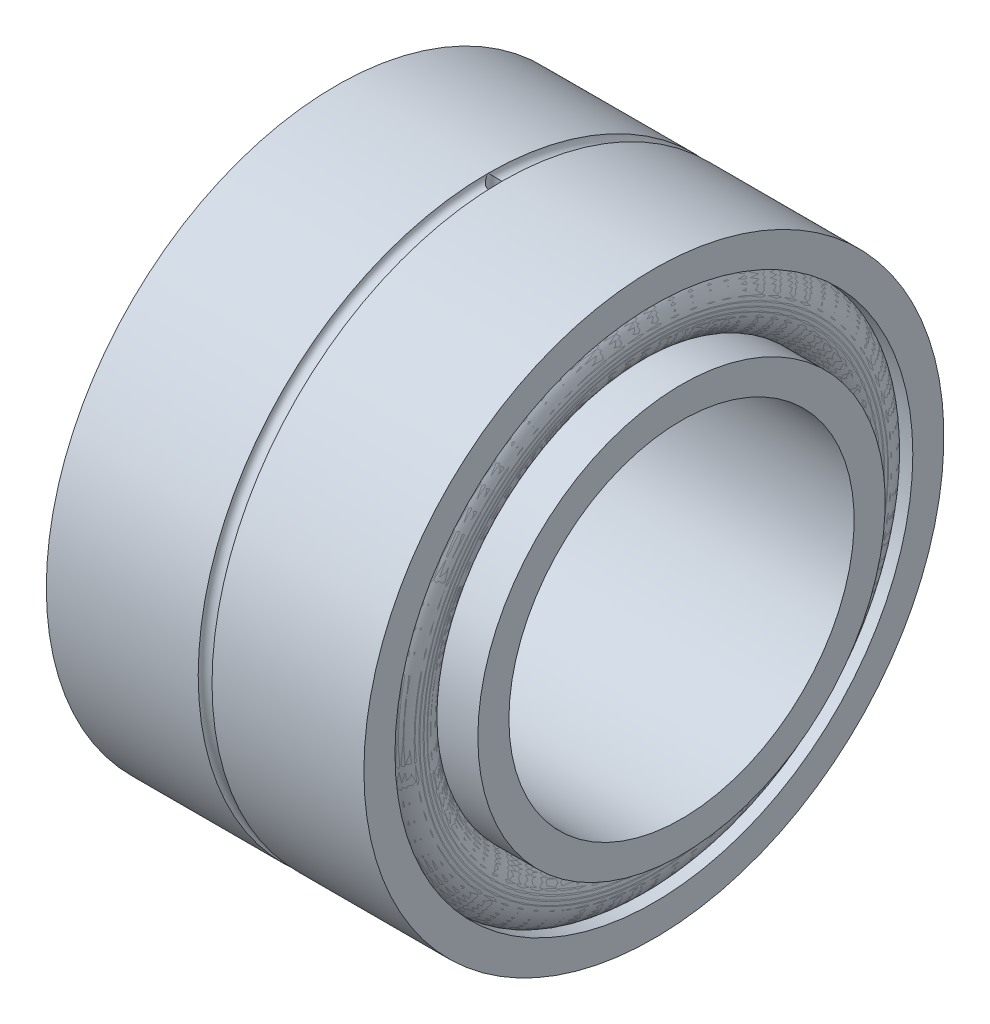
ISO-10303-21;
HEADER;
FILE_DESCRIPTION(('STEP AP214'),'2;1');
FILE_NAME('part.step','',(''),(''),'','','');
FILE_SCHEMA(('AUTOMOTIVE_DESIGN { 1 0 10303 214 1 1 1 1 }'));
ENDSEC;
DATA;
#1=APPLICATION_CONTEXT('core data for automotive mechanical design processes');
#2=APPLICATION_PROTOCOL_DEFINITION('international standard','automotive_design',2000,#1);
#3=PRODUCT_CONTEXT('',#1,'mechanical');
#4=PRODUCT('Part','Part','',(#3));
#5=PRODUCT_RELATED_PRODUCT_CATEGORY('part','',(#4));
#6=PRODUCT_DEFINITION_FORMATION('','',#4);
#7=PRODUCT_DEFINITION_CONTEXT('part definition',#1,'design');
#8=PRODUCT_DEFINITION('design','',#6,#7);
#9=PRODUCT_DEFINITION_SHAPE('','',#8);
#10=(LENGTH_UNIT() NAMED_UNIT(*) SI_UNIT(.MILLI.,.METRE.));
#11=(NAMED_UNIT(*) PLANE_ANGLE_UNIT() SI_UNIT($,.RADIAN.));
#12=(NAMED_UNIT(*) SI_UNIT($,.STERADIAN.) SOLID_ANGLE_UNIT());
#13=UNCERTAINTY_MEASURE_WITH_UNIT(LENGTH_MEASURE(1.E-05),#10,'distance_accuracy_value','');
#14=(GEOMETRIC_REPRESENTATION_CONTEXT(3) GLOBAL_UNCERTAINTY_ASSIGNED_CONTEXT((#13)) GLOBAL_UNIT_ASSIGNED_CONTEXT((#10,
#11,#12)) REPRESENTATION_CONTEXT('',''));
#15=CARTESIAN_POINT('',(0.,0.,0.));
#16=DIRECTION('',(0.,0.,1.));
#17=DIRECTION('',(1.,0.,0.));
#18=AXIS2_PLACEMENT_3D('',#15,#16,#17);
#19=CARTESIAN_POINT('',(0.,0.,0.));
#20=DIRECTION('',(-1.,0.,0.));
#21=DIRECTION('',(0.,0.,1.));
#22=AXIS2_PLACEMENT_3D('',#19,#20,#21);
#23=CYLINDRICAL_SURFACE('',#22,14.75);
#24=CARTESIAN_POINT('',(0.,0.,0.));
#25=DIRECTION('',(-1.,0.,0.));
#26=DIRECTION('',(0.,0.,1.));
#27=AXIS2_PLACEMENT_3D('',#24,#25,#26);
#28=CIRCLE('',#27,14.75);
#29=CARTESIAN_POINT('',(0.,0.,14.75));
#30=VERTEX_POINT('',#29);
#31=EDGE_CURVE('E11',#30,#30,#28,.T.);
#32=ORIENTED_EDGE('',*,*,#31,.F.);
#33=EDGE_LOOP('',(#32));
#34=FACE_BOUND('',#33,.T.);
#35=CARTESIAN_POINT('',(2.,0.,0.));
#36=DIRECTION('',(-1.,0.,0.));
#37=DIRECTION('',(0.,0.,1.));
#38=AXIS2_PLACEMENT_3D('',#35,#36,#37);
#39=CIRCLE('',#38,14.75);
#40=CARTESIAN_POINT('',(2.,0.,14.75));
#41=VERTEX_POINT('',#40);
#42=EDGE_CURVE('E114',#41,#41,#39,.T.);
#43=ORIENTED_EDGE('',*,*,#42,.T.);
#44=EDGE_LOOP('',(#43));
#45=FACE_BOUND('',#44,.T.);
#46=ADVANCED_FACE('F37',(#34,#45),#23,.T.);
#47=CARTESIAN_POINT('',(0.,14.75,0.));
#48=DIRECTION('',(1.,0.,0.));
#49=DIRECTION('',(0.,0.,-1.));
#50=AXIS2_PLACEMENT_3D('',#47,#48,#49);
#51=PLANE('',#50);
#52=CARTESIAN_POINT('',(0.,0.,0.));
#53=DIRECTION('',(-1.,0.,0.));
#54=DIRECTION('',(0.,0.,1.));
#55=AXIS2_PLACEMENT_3D('',#52,#53,#54);
#56=CIRCLE('',#55,12.5);
#57=CARTESIAN_POINT('',(0.,0.,12.5));
#58=VERTEX_POINT('',#57);
#59=EDGE_CURVE('E50',#58,#58,#56,.T.);
#60=ORIENTED_EDGE('',*,*,#59,.F.);
#61=EDGE_LOOP('',(#60));
#62=FACE_BOUND('',#61,.T.);
#63=ORIENTED_EDGE('',*,*,#31,.T.);
#64=EDGE_LOOP('',(#63));
#65=FACE_BOUND('',#64,.T.);
#66=ADVANCED_FACE('F105',(#62,#65),#51,.F.);
#67=CARTESIAN_POINT('',(0.,0.,0.));
#68=DIRECTION('',(-1.,0.,0.));
#69=DIRECTION('',(0.,0.,1.));
#70=AXIS2_PLACEMENT_3D('',#67,#68,#69);
#71=CYLINDRICAL_SURFACE('',#70,12.5);
#72=CARTESIAN_POINT('',(11.5,12.4899959967968,0.500000000000001));
#73=CARTESIAN_POINT('',(11.5280731633728,12.4899961315224,0.499998758798746));
#74=CARTESIAN_POINT('',(11.5561663964834,12.4900916618139,0.497627754285823));
#75=CARTESIAN_POINT('',(11.611578333317,12.4904635421187,0.488202712247756));
#76=CARTESIAN_POINT('',(11.6388960771565,12.4907401068309,0.481143114107626));
#77=CARTESIAN_POINT('',(11.6919462896622,12.4914426775378,0.462542918883272));
#78=CARTESIAN_POINT('',(11.7176795407324,12.4918686090698,0.451004554257524));
#79=CARTESIAN_POINT('',(11.7668367926558,12.4928218248314,0.423777660159961));
#80=CARTESIAN_POINT('',(11.7902613472097,12.4933490846693,0.408090129134241));
#81=CARTESIAN_POINT('',(11.8341597593796,12.4944459704595,0.372997754449342));
#82=CARTESIAN_POINT('',(11.8546318245942,12.4950156218316,0.353590669226713));
#83=CARTESIAN_POINT('',(11.8920289255691,12.4961328567103,0.311614354933469));
#84=CARTESIAN_POINT('',(11.9089538185401,12.4966804393279,0.289044998628435));
#85=CARTESIAN_POINT('',(11.93878028225,12.4976919893825,0.241376432340117));
#86=CARTESIAN_POINT('',(11.9516805764639,12.4981559302703,0.216276423015971));
#87=CARTESIAN_POINT('',(11.9730834220647,12.4989476710099,0.164264700944849));
#88=CARTESIAN_POINT('',(11.9815859979237,12.4992754716193,0.137352998280408));
#89=CARTESIAN_POINT('',(11.9939476435077,12.4997578274104,0.0824972113326851));
#90=CARTESIAN_POINT('',(11.9978092186378,12.4999124760636,0.0545536924725131));
#91=CARTESIAN_POINT('',(12.0007869734338,12.5000314109699,-0.00158535117207557));
#92=CARTESIAN_POINT('',(11.9999031800914,12.4999956983058,-0.0297808745221764));
#93=CARTESIAN_POINT('',(11.9934173785891,12.4997380149168,-0.0856065942701125));
#94=CARTESIAN_POINT('',(11.9878180698984,12.4995161507575,-0.113237104850641));
#95=CARTESIAN_POINT('',(11.9720643622813,12.4989112854575,-0.167165670443889));
#96=CARTESIAN_POINT('',(11.9619099493462,12.4985282838213,-0.193463721358538));
#97=CARTESIAN_POINT('',(11.937331190201,12.4976441157177,-0.243989559590989));
#98=CARTESIAN_POINT('',(11.9229056099518,12.4971429151084,-0.268216745977477));
#99=CARTESIAN_POINT('',(11.8901949127873,12.4960788152025,-0.313906557044654));
#100=CARTESIAN_POINT('',(11.8719097789825,12.4955159156358,-0.335369169626789));
#101=CARTESIAN_POINT('',(11.8319837517768,12.4943913691821,-0.374936326435157));
#102=CARTESIAN_POINT('',(11.8103405165538,12.4938297234487,-0.393038507716344));
#103=CARTESIAN_POINT('',(11.7643209026412,12.492771400904,-0.425352751577676));
#104=CARTESIAN_POINT('',(11.7399445233982,12.4922747241059,-0.439564813370346));
#105=CARTESIAN_POINT('',(11.689149204464,12.4914023756991,-0.463695156244904));
#106=CARTESIAN_POINT('',(11.6627302257815,12.491026706401,-0.473613355337232));
#107=CARTESIAN_POINT('',(11.6086002658312,12.490438827807,-0.488872885770283));
#108=CARTESIAN_POINT('',(11.5808892907914,12.4902266177232,-0.494214239170919));
#109=CARTESIAN_POINT('',(11.524982520474,12.4899897312153,-0.500165547407392));
#110=CARTESIAN_POINT('',(11.4967870744922,12.4899649249297,-0.500778778601815));
#111=CARTESIAN_POINT('',(11.4406936552421,12.490105304363,-0.497264978377538));
#112=CARTESIAN_POINT('',(11.41279568135,12.4902704896835,-0.493137956901041));
#113=CARTESIAN_POINT('',(11.358098295749,12.4907721140578,-0.480263517491169));
#114=CARTESIAN_POINT('',(11.3312985319235,12.4911084977489,-0.471517593196316));
#115=CARTESIAN_POINT('',(11.2795474852272,12.4919145543835,-0.449655125479494));
#116=CARTESIAN_POINT('',(11.2545962091386,12.4923842278159,-0.436538566022295));
#117=CARTESIAN_POINT('',(11.2072353286888,12.4934042386814,-0.406298729404581));
#118=CARTESIAN_POINT('',(11.1848271326692,12.4939546204274,-0.38917324805053));
#119=CARTESIAN_POINT('',(11.1432026539284,12.4950738514507,-0.351404926283488));
#120=CARTESIAN_POINT('',(11.1239863847076,12.4956427008063,-0.330762070994354));
#121=CARTESIAN_POINT('',(11.0892802699084,12.4967351243546,-0.286530925488426));
#122=CARTESIAN_POINT('',(11.0737925384553,12.4972586727539,-0.26294097569357));
#123=CARTESIAN_POINT('',(11.0469975887314,12.4982011149901,-0.213493699311902));
#124=CARTESIAN_POINT('',(11.0356903571848,12.4986200091592,-0.187636379925753));
#125=CARTESIAN_POINT('',(11.0175810839965,12.4993058040844,-0.134396283000121));
#126=CARTESIAN_POINT('',(11.0107776803824,12.4995727507864,-0.107013969341906));
#127=CARTESIAN_POINT('',(11.001864723718,12.4999247446076,-0.0514946355329714));
#128=CARTESIAN_POINT('',(10.9997551567742,12.5000097922652,-0.0233576176163739));
#129=CARTESIAN_POINT('',(11.0002899097484,12.4999884051138,0.0328513731026792));
#130=CARTESIAN_POINT('',(11.0029309069794,12.4998821041397,0.0609233776279574));
#131=CARTESIAN_POINT('',(11.0128849677852,12.4994902558297,0.116225169175839));
#132=CARTESIAN_POINT('',(11.0201980404413,12.4992047081453,0.14345495456128));
#133=CARTESIAN_POINT('',(11.0392880611364,12.4984865131084,0.196300261550113));
#134=CARTESIAN_POINT('',(11.0510650696124,12.4980538637642,0.221915761292294));
#135=CARTESIAN_POINT('',(11.078747897787,12.4970901740698,0.270805791204833));
#136=CARTESIAN_POINT('',(11.094653578073,12.496559137042,0.29408040038314));
#137=CARTESIAN_POINT('',(11.1301534802439,12.4954580704139,0.337644146779995));
#138=CARTESIAN_POINT('',(11.1497498799467,12.4948880179186,0.357931508626453));
#139=CARTESIAN_POINT('',(11.1920761140362,12.4937732712101,0.394934334528151));
#140=CARTESIAN_POINT('',(11.2148067209179,12.4932285832932,0.411648915394001));
#141=CARTESIAN_POINT('',(11.2627689311172,12.4922257291581,0.441036725205957));
#142=CARTESIAN_POINT('',(11.28800248008,12.4917676310666,0.453706777379508));
#143=CARTESIAN_POINT('',(11.3402212443404,12.4909907754811,0.474615582615989));
#144=CARTESIAN_POINT('',(11.367204336529,12.4906718525999,0.48285959800979));
#145=CARTESIAN_POINT('',(11.4119638886124,12.4902942095784,0.492507314414766));
#146=CARTESIAN_POINT('',(11.4294500810227,12.4901828688378,0.495313513479019));
#147=CARTESIAN_POINT('',(11.4646215249919,12.490033720011,0.499060246908735));
#148=CARTESIAN_POINT('',(11.4823067764443,12.4899959118854,0.500000782272058));
#149=CARTESIAN_POINT('',(11.5,12.4899959967968,0.500000000000001));
#150=B_SPLINE_CURVE_WITH_KNOTS('',3,(#72,#73,#74,#75,#76,#77,#78,#79,#80,#81,#82,#83,#84,#85,
#86,#87,#88,#89,#90,#91,#92,#93,#94,#95,#96,#97,#98,#99,#100,#101,#102,#103,#104,#105,#106,#107,
#108,#109,#110,#111,#112,#113,#114,#115,#116,#117,#118,#119,#120,#121,#122,#123,#124,#125,#126,
#127,#128,#129,#130,#131,#132,#133,#134,#135,#136,#137,#138,#139,#140,#141,#142,#143,#144,#145,
#146,#147,#148,#149),.UNSPECIFIED.,.T.,.F.,(4,2,2,2,2,2,2,2,2,2,2,2,2,2,2,2,2,2,2,2,2,2,2,2,2,2,
2,2,2,2,2,2,2,2,2,2,2,2,4),(0.,0.0841549055975086,0.168409796543895,0.252622744132736,
0.336815445315113,0.421059045094545,0.505306035400841,0.589579720121229,0.673852935875892,
0.758080636981674,0.842307858999574,0.926486896599877,1.01066619308291,1.09486983468679,
1.17907384477697,1.26333684192479,1.34759985612988,1.43186447923197,1.51612869618519,
1.60033451688446,1.68454016097082,1.76871859170034,1.85289733127176,1.93712246332912,
2.02134795161138,2.10562108485665,2.18989395047879,2.27414132005547,2.35838844026539,
2.44257665842245,2.52676504021994,2.61095456188051,2.69514124108648,2.77937775365915,
2.86363506542887,2.94795839513712,3.03218124544945,3.08522023983213,3.13825920584662),.UNSPECIFIED.);
#151=CARTESIAN_POINT('',(11.5,12.4899959967968,0.500000000000001));
#152=VERTEX_POINT('',#151);
#153=EDGE_CURVE('E70',#152,#152,#150,.T.);
#154=ORIENTED_EDGE('',*,*,#153,.T.);
#155=EDGE_LOOP('',(#154));
#156=FACE_BOUND('',#155,.T.);
#157=CARTESIAN_POINT('',(25.,0.,0.));
#158=DIRECTION('',(-1.,0.,0.));
#159=DIRECTION('',(0.,0.,1.));
#160=AXIS2_PLACEMENT_3D('',#157,#158,#159);
#161=CIRCLE('',#160,12.5);
#162=CARTESIAN_POINT('',(25.,0.,12.5));
#163=VERTEX_POINT('',#162);
#164=EDGE_CURVE('E97',#163,#163,#161,.T.);
#165=ORIENTED_EDGE('',*,*,#164,.F.);
#166=EDGE_LOOP('',(#165));
#167=FACE_BOUND('',#166,.T.);
#168=ORIENTED_EDGE('',*,*,#59,.T.);
#169=EDGE_LOOP('',(#168));
#170=FACE_BOUND('',#169,.T.);
#171=ADVANCED_FACE('F103',(#156,#167,#170),#71,.F.);
#172=CARTESIAN_POINT('',(25.,12.5,0.));
#173=DIRECTION('',(-1.,0.,0.));
#174=DIRECTION('',(0.,0.,1.));
#175=AXIS2_PLACEMENT_3D('',#172,#173,#174);
#176=PLANE('',#175);
#177=CARTESIAN_POINT('',(25.,0.,0.));
#178=DIRECTION('',(-1.,0.,0.));
#179=DIRECTION('',(0.,0.,1.));
#180=AXIS2_PLACEMENT_3D('',#177,#178,#179);
#181=CIRCLE('',#180,14.75);
#182=CARTESIAN_POINT('',(25.,0.,14.75));
#183=VERTEX_POINT('',#182);
#184=EDGE_CURVE('E94',#183,#183,#181,.T.);
#185=ORIENTED_EDGE('',*,*,#184,.F.);
#186=EDGE_LOOP('',(#185));
#187=FACE_BOUND('',#186,.T.);
#188=ORIENTED_EDGE('',*,*,#164,.T.);
#189=EDGE_LOOP('',(#188));
#190=FACE_BOUND('',#189,.T.);
#191=ADVANCED_FACE('F386',(#187,#190),#176,.F.);
#192=CARTESIAN_POINT('',(0.,0.,0.));
#193=DIRECTION('',(-1.,0.,0.));
#194=DIRECTION('',(0.,0.,1.));
#195=AXIS2_PLACEMENT_3D('',#192,#193,#194);
#196=CYLINDRICAL_SURFACE('',#195,14.75);
#197=CARTESIAN_POINT('',(22.,0.,0.));
#198=DIRECTION('',(-1.,0.,0.));
#199=DIRECTION('',(0.,0.,1.));
#200=AXIS2_PLACEMENT_3D('',#197,#198,#199);
#201=CIRCLE('',#200,14.75);
#202=CARTESIAN_POINT('',(22.,0.,14.75));
#203=VERTEX_POINT('',#202);
#204=EDGE_CURVE('E91',#203,#203,#201,.T.);
#205=ORIENTED_EDGE('',*,*,#204,.F.);
#206=EDGE_LOOP('',(#205));
#207=FACE_BOUND('',#206,.T.);
#208=ORIENTED_EDGE('',*,*,#184,.T.);
#209=EDGE_LOOP('',(#208));
#210=FACE_BOUND('',#209,.T.);
#211=ADVANCED_FACE('F284',(#207,#210),#196,.T.);
#212=CARTESIAN_POINT('',(20.4983339252683,0.,0.));
#213=DIRECTION('',(-1.,0.,0.));
#214=DIRECTION('',(0.,0.,1.));
#215=AXIS2_PLACEMENT_3D('',#212,#213,#214);
#216=TOROIDAL_SURFACE('',#215,16.75,2.501);
#217=CARTESIAN_POINT('',(22.,0.,0.));
#218=DIRECTION('',(-1.,0.,0.));
#219=DIRECTION('',(0.,0.,1.));
#220=AXIS2_PLACEMENT_3D('',#217,#218,#219);
#221=CIRCLE('',#220,18.75);
#222=CARTESIAN_POINT('',(22.,0.,18.75));
#223=VERTEX_POINT('',#222);
#224=EDGE_CURVE('E88',#223,#223,#221,.T.);
#225=ORIENTED_EDGE('',*,*,#224,.F.);
#226=EDGE_LOOP('',(#225));
#227=FACE_BOUND('',#226,.T.);
#228=ORIENTED_EDGE('',*,*,#204,.T.);
#229=EDGE_LOOP('',(#228));
#230=FACE_BOUND('',#229,.T.);
#231=ADVANCED_FACE('F279',(#227,#230),#216,.T.);
#232=CARTESIAN_POINT('',(0.,0.,0.));
#233=DIRECTION('',(-1.,0.,0.));
#234=DIRECTION('',(0.,0.,1.));
#235=AXIS2_PLACEMENT_3D('',#232,#233,#234);
#236=CYLINDRICAL_SURFACE('',#235,18.75);
#237=CARTESIAN_POINT('',(23.,0.,0.));
#238=DIRECTION('',(-1.,0.,0.));
#239=DIRECTION('',(0.,0.,1.));
#240=AXIS2_PLACEMENT_3D('',#237,#238,#239);
#241=CIRCLE('',#240,18.75);
#242=CARTESIAN_POINT('',(23.,0.,18.75));
#243=VERTEX_POINT('',#242);
#244=EDGE_CURVE('E85',#243,#243,#241,.T.);
#245=ORIENTED_EDGE('',*,*,#244,.F.);
#246=EDGE_LOOP('',(#245));
#247=FACE_BOUND('',#246,.T.);
#248=ORIENTED_EDGE('',*,*,#224,.T.);
#249=EDGE_LOOP('',(#248));
#250=FACE_BOUND('',#249,.T.);
#251=ADVANCED_FACE('F283',(#247,#250),#236,.F.);
#252=CARTESIAN_POINT('',(23.,21.,0.));
#253=DIRECTION('',(-1.,0.,0.));
#254=DIRECTION('',(0.,0.,1.));
#255=AXIS2_PLACEMENT_3D('',#252,#253,#254);
#256=PLANE('',#255);
#257=CARTESIAN_POINT('',(23.,0.,0.));
#258=DIRECTION('',(-1.,0.,0.));
#259=DIRECTION('',(0.,0.,1.));
#260=AXIS2_PLACEMENT_3D('',#257,#258,#259);
#261=CIRCLE('',#260,21.);
#262=CARTESIAN_POINT('',(23.,0.,21.));
#263=VERTEX_POINT('',#262);
#264=EDGE_CURVE('E76',#263,#263,#261,.T.);
#265=ORIENTED_EDGE('',*,*,#264,.F.);
#266=EDGE_LOOP('',(#265));
#267=FACE_BOUND('',#266,.T.);
#268=ORIENTED_EDGE('',*,*,#244,.T.);
#269=EDGE_LOOP('',(#268));
#270=FACE_BOUND('',#269,.T.);
#271=ADVANCED_FACE('F299',(#267,#270),#256,.F.);
#272=CARTESIAN_POINT('',(0.,0.,0.));
#273=DIRECTION('',(-1.,0.,0.));
#274=DIRECTION('',(0.,0.,1.));
#275=AXIS2_PLACEMENT_3D('',#272,#273,#274);
#276=CYLINDRICAL_SURFACE('',#275,21.);
#277=CARTESIAN_POINT('',(12.,0.,0.));
#278=DIRECTION('',(-1.,0.,0.));
#279=DIRECTION('',(0.,0.,1.));
#280=AXIS2_PLACEMENT_3D('',#277,#278,#279);
#281=CIRCLE('',#280,21.);
#282=CARTESIAN_POINT('',(12.,21.,8.21536864509901E-12));
#283=VERTEX_POINT('',#282);
#284=EDGE_CURVE('E69',#283,#283,#281,.T.);
#285=ORIENTED_EDGE('',*,*,#284,.F.);
#286=EDGE_LOOP('',(#285));
#287=FACE_BOUND('',#286,.T.);
#288=ORIENTED_EDGE('',*,*,#264,.T.);
#289=EDGE_LOOP('',(#288));
#290=FACE_BOUND('',#289,.T.);
#291=ADVANCED_FACE('F141',(#287,#290),#276,.T.);
#292=CARTESIAN_POINT('',(11.5,0.,0.));
#293=DIRECTION('',(-1.,0.,0.));
#294=DIRECTION('',(0.,0.,1.));
#295=AXIS2_PLACEMENT_3D('',#292,#293,#294);
#296=TOROIDAL_SURFACE('',#295,21.,0.5);
#297=ORIENTED_EDGE('',*,*,#284,.T.);
#298=CARTESIAN_POINT('',(12.,21.,0.));
#299=CARTESIAN_POINT('',(11.9999999894512,20.998945955473,0.00105404534400834));
#300=CARTESIAN_POINT('',(11.9999966569991,20.9978918191476,0.00210810226680753));
#301=CARTESIAN_POINT('',(11.9997463425742,20.9582476307711,0.041746291551112));
#302=CARTESIAN_POINT('',(11.995048819956,20.9195510799477,0.0803296392755748));
#303=CARTESIAN_POINT('',(11.9765312981658,20.8430670999877,0.156381346187626));
#304=CARTESIAN_POINT('',(11.9626921225848,20.8052817553596,0.193847188144932));
#305=CARTESIAN_POINT('',(11.9308470533429,20.7431387014428,0.255306080261897));
#306=CARTESIAN_POINT('',(11.9153419792344,20.718157300063,0.279965224956629));
#307=CARTESIAN_POINT('',(11.8791689322929,20.6701382662148,0.327284657738965));
#308=CARTESIAN_POINT('',(11.8585128942728,20.6470963028735,0.349949404869377));
#309=CARTESIAN_POINT('',(11.8178916251667,20.6097512366989,0.386628717409878));
#310=CARTESIAN_POINT('',(11.7992002493609,20.5947526138047,0.401341861928483));
#311=CARTESIAN_POINT('',(11.7587489284457,20.567007427282,0.428533260952529));
#312=CARTESIAN_POINT('',(11.736992973907,20.5542579827377,0.441014374695213));
#313=CARTESIAN_POINT('',(11.6953676241195,20.5341324187566,0.460702044189775));
#314=CARTESIAN_POINT('',(11.6760380439923,20.5261903480944,0.468465600829582));
#315=CARTESIAN_POINT('',(11.6358079814702,20.5126797284972,0.481667051984113));
#316=CARTESIAN_POINT('',(11.6149086416957,20.5071094724536,0.487106619195084));
#317=CARTESIAN_POINT('',(11.5718823887387,20.4987245896557,0.495293057935772));
#318=CARTESIAN_POINT('',(11.5497479754487,20.4959293169951,0.498021017551269));
#319=CARTESIAN_POINT('',(11.5051409078141,20.493418477257,0.500471451718323));
#320=CARTESIAN_POINT('',(11.4826684039919,20.4937015779309,0.500195226411402));
#321=CARTESIAN_POINT('',(11.4406815199238,20.4971129962747,0.496865734525802));
#322=CARTESIAN_POINT('',(11.4211145694312,20.4999235947071,0.494122573028214));
#323=CARTESIAN_POINT('',(11.3828711490719,20.5077526691316,0.486478467930016));
#324=CARTESIAN_POINT('',(11.364194837036,20.512771534853,0.4815771434427));
#325=CARTESIAN_POINT('',(11.3272451742863,20.5250007401874,0.469628174959689));
#326=CARTESIAN_POINT('',(11.3090319445559,20.5323029332826,0.462490538916737));
#327=CARTESIAN_POINT('',(11.2742001415373,20.5486283352776,0.446522390942034));
#328=CARTESIAN_POINT('',(11.2575824170272,20.5576524526662,0.437690985363386));
#329=CARTESIAN_POINT('',(11.2170936403185,20.5825818087605,0.413275129034756));
#330=CARTESIAN_POINT('',(11.194437110329,20.5994918937388,0.396696615414834));
#331=CARTESIAN_POINT('',(11.1531789235416,20.6356551905557,0.361192014944732));
#332=CARTESIAN_POINT('',(11.134588408964,20.6549146211381,0.342259694885186));
#333=CARTESIAN_POINT('',(11.0947315057806,20.7028734466072,0.295042988544211));
#334=CARTESIAN_POINT('',(11.0752655919141,20.7323172828095,0.265998454921077));
#335=CARTESIAN_POINT('',(11.04317101878,20.7929338794909,0.206067211144992));
#336=CARTESIAN_POINT('',(11.0305461296007,20.8241075828895,0.175179495601754));
#337=CARTESIAN_POINT('',(11.0141926338528,20.8789523003911,0.12071174882917));
#338=CARTESIAN_POINT('',(11.0089945341905,20.9024282045199,0.0973583920397617));
#339=CARTESIAN_POINT('',(11.0019809623923,20.9495593926876,0.0503932052048358));
#340=CARTESIAN_POINT('',(11.0001593126637,20.9732142694648,0.0267819268635303));
#341=CARTESIAN_POINT('',(11.0000033361897,20.9978918025565,0.00210811844470142));
#342=CARTESIAN_POINT('',(11.000000003358,20.9989459390144,0.00105406137876489));
#343=CARTESIAN_POINT('',(11.,21.,0.));
#344=B_SPLINE_CURVE_WITH_KNOTS('',3,(#298,#299,#300,#301,#302,#303,#304,#305,#306,#307,#308,
#309,#310,#311,#312,#313,#314,#315,#316,#317,#318,#319,#320,#321,#322,#323,#324,#325,#326,#327,
#328,#329,#330,#331,#332,#333,#334,#335,#336,#337,#338,#339,#340,#341,#342,#343),.UNSPECIFIED.,
.F.,.F.,(4,2,2,2,2,2,2,2,2,2,2,2,2,2,2,2,2,2,2,2,2,2,4),(0.,0.00447214713703444,
0.168176793343513,0.332225937310132,0.4469909328736,0.561492448604475,0.645580276244863,
0.729559603287025,0.796177495124725,0.862747357486724,0.929778315680987,0.996780265586767,
1.0563815870299,1.11599343152243,1.17840498370017,1.240849555772,1.33861785322171,
1.43665080137575,1.57305266744171,1.7095296283156,1.80992892375873,1.91014434544395,
1.91461649258099),.UNSPECIFIED.);
#345=CARTESIAN_POINT('',(11.,21.,0.));
#346=VERTEX_POINT('',#345);
#347=EDGE_CURVE('E56',#283,#346,#344,.T.);
#348=ORIENTED_EDGE('',*,*,#347,.T.);
#349=CARTESIAN_POINT('',(11.,0.,0.));
#350=DIRECTION('',(-1.,0.,0.));
#351=DIRECTION('',(0.,0.,1.));
#352=AXIS2_PLACEMENT_3D('',#349,#350,#351);
#353=CIRCLE('',#352,21.);
#354=EDGE_CURVE('E67',#346,#346,#353,.T.);
#355=ORIENTED_EDGE('',*,*,#354,.F.);
#356=CARTESIAN_POINT('',(11.,21.,0.));
#357=CARTESIAN_POINT('',(11.0000000105488,20.998945955473,-0.00105404534400834));
#358=CARTESIAN_POINT('',(11.0000033430009,20.9978918191476,-0.00210810226680753));
#359=CARTESIAN_POINT('',(11.0002536574258,20.9582476307711,-0.041746291551112));
#360=CARTESIAN_POINT('',(11.004951180044,20.9195510799477,-0.0803296392755747));
#361=CARTESIAN_POINT('',(11.0234687018342,20.8430670999877,-0.156381346187625));
#362=CARTESIAN_POINT('',(11.0373078774152,20.8052817553596,-0.193847188144932));
#363=CARTESIAN_POINT('',(11.0691529466571,20.7431387014428,-0.255306080261898));
#364=CARTESIAN_POINT('',(11.0846580207656,20.718157300063,-0.27996522495663));
#365=CARTESIAN_POINT('',(11.1208310677071,20.6701382662148,-0.327284657738966));
#366=CARTESIAN_POINT('',(11.1414871057272,20.6470963028735,-0.349949404869378));
#367=CARTESIAN_POINT('',(11.1821083748333,20.6097512366989,-0.386628717409878));
#368=CARTESIAN_POINT('',(11.2007997506391,20.5947526138047,-0.401341861928483));
#369=CARTESIAN_POINT('',(11.2412510715543,20.567007427282,-0.428533260952529));
#370=CARTESIAN_POINT('',(11.263007026093,20.5542579827377,-0.441014374695213));
#371=CARTESIAN_POINT('',(11.3046323758805,20.5341324187566,-0.460702044189775));
#372=CARTESIAN_POINT('',(11.3239619560077,20.5261903480944,-0.468465600829582));
#373=CARTESIAN_POINT('',(11.3641920185298,20.5126797284972,-0.481667051984113));
#374=CARTESIAN_POINT('',(11.3850913583043,20.5071094724536,-0.487106619195084));
#375=CARTESIAN_POINT('',(11.4281176112613,20.4987245896557,-0.495293057935772));
#376=CARTESIAN_POINT('',(11.4502520245513,20.4959293169951,-0.498021017551269));
#377=CARTESIAN_POINT('',(11.4948590921859,20.493418477257,-0.500471451718323));
#378=CARTESIAN_POINT('',(11.5173315960081,20.4937015779309,-0.500195226411402));
#379=CARTESIAN_POINT('',(11.5593184800762,20.4971129962747,-0.496865734525803));
#380=CARTESIAN_POINT('',(11.5788854305688,20.4999235947071,-0.494122573028214));
#381=CARTESIAN_POINT('',(11.6171288509281,20.5077526691316,-0.486478467930016));
#382=CARTESIAN_POINT('',(11.635805162964,20.512771534853,-0.4815771434427));
#383=CARTESIAN_POINT('',(11.6727548257137,20.5250007401874,-0.46962817495969));
#384=CARTESIAN_POINT('',(11.6909680554441,20.5323029332826,-0.462490538916738));
#385=CARTESIAN_POINT('',(11.7257998584627,20.5486283352776,-0.446522390942035));
#386=CARTESIAN_POINT('',(11.7424175829728,20.5576524526662,-0.437690985363387));
#387=CARTESIAN_POINT('',(11.7829063596815,20.5825818087605,-0.413275129034757));
#388=CARTESIAN_POINT('',(11.805562889671,20.5994918937388,-0.396696615414835));
#389=CARTESIAN_POINT('',(11.8468210764584,20.6356551905557,-0.361192014944734));
#390=CARTESIAN_POINT('',(11.865411591036,20.6549146211381,-0.342259694885189));
#391=CARTESIAN_POINT('',(11.9052684942194,20.7028734466072,-0.295042988544215));
#392=CARTESIAN_POINT('',(11.9247344080859,20.7323172828095,-0.26599845492108));
#393=CARTESIAN_POINT('',(11.95682898122,20.7929338794909,-0.206067211144993));
#394=CARTESIAN_POINT('',(11.9694538703993,20.8241075828895,-0.175179495601755));
#395=CARTESIAN_POINT('',(11.9858073661472,20.8789523003911,-0.12071174882917));
#396=CARTESIAN_POINT('',(11.9910054658095,20.9024282045199,-0.0973583920397621));
#397=CARTESIAN_POINT('',(11.9980190376077,20.9495593926876,-0.0503932052048373));
#398=CARTESIAN_POINT('',(11.9998406873363,20.9732142694648,-0.0267819268635329));
#399=CARTESIAN_POINT('',(11.9999966638103,20.9978918025565,-0.0021081184447018));
#400=CARTESIAN_POINT('',(11.999999996642,20.9989459390144,-0.00105406137876509));
#401=CARTESIAN_POINT('',(12.,21.,0.));
#402=B_SPLINE_CURVE_WITH_KNOTS('',3,(#356,#357,#358,#359,#360,#361,#362,#363,#364,#365,#366,
#367,#368,#369,#370,#371,#372,#373,#374,#375,#376,#377,#378,#379,#380,#381,#382,#383,#384,#385,
#386,#387,#388,#389,#390,#391,#392,#393,#394,#395,#396,#397,#398,#399,#400,#401),.UNSPECIFIED.,
.F.,.F.,(4,2,2,2,2,2,2,2,2,2,2,2,2,2,2,2,2,2,2,2,2,2,4),(0.,0.00447214713703444,
0.168176793343512,0.332225937310132,0.446990932873602,0.561492448604475,0.645580276244863,
0.729559603287025,0.796177495124725,0.862747357486724,0.929778315680989,0.996780265586765,
1.0563815870299,1.11599343152242,1.17840498370016,1.240849555772,1.33861785322171,
1.43665080137575,1.57305266744171,1.70952962831559,1.80992892375873,1.91014434544395,
1.91461649258099),.UNSPECIFIED.);
#403=EDGE_CURVE('E58',#346,#283,#402,.T.);
#404=ORIENTED_EDGE('',*,*,#403,.T.);
#405=EDGE_LOOP('',(#297,#348,#355,#404));
#406=FACE_BOUND('',#405,.T.);
#407=ADVANCED_FACE('F66',(#406),#296,.F.);
#408=CARTESIAN_POINT('',(0.,0.,0.));
#409=DIRECTION('',(-1.,0.,0.));
#410=DIRECTION('',(0.,0.,1.));
#411=AXIS2_PLACEMENT_3D('',#408,#409,#410);
#412=CYLINDRICAL_SURFACE('',#411,21.);
#413=CARTESIAN_POINT('',(0.,0.,0.));
#414=DIRECTION('',(-1.,0.,0.));
#415=DIRECTION('',(0.,0.,1.));
#416=AXIS2_PLACEMENT_3D('',#413,#414,#415);
#417=CIRCLE('',#416,21.);
#418=CARTESIAN_POINT('',(0.,0.,21.));
#419=VERTEX_POINT('',#418);
#420=EDGE_CURVE('E74',#419,#419,#417,.T.);
#421=ORIENTED_EDGE('',*,*,#420,.F.);
#422=EDGE_LOOP('',(#421));
#423=FACE_BOUND('',#422,.T.);
#424=ORIENTED_EDGE('',*,*,#354,.T.);
#425=EDGE_LOOP('',(#424));
#426=FACE_BOUND('',#425,.T.);
#427=ADVANCED_FACE('F73',(#423,#426),#412,.T.);
#428=CARTESIAN_POINT('',(0.,18.75,0.));
#429=DIRECTION('',(1.,0.,0.));
#430=DIRECTION('',(0.,0.,-1.));
#431=AXIS2_PLACEMENT_3D('',#428,#429,#430);
#432=PLANE('',#431);
#433=CARTESIAN_POINT('',(0.,0.,0.));
#434=DIRECTION('',(-1.,0.,0.));
#435=DIRECTION('',(0.,0.,1.));
#436=AXIS2_PLACEMENT_3D('',#433,#434,#435);
#437=CIRCLE('',#436,18.75);
#438=CARTESIAN_POINT('',(0.,0.,18.75));
#439=VERTEX_POINT('',#438);
#440=EDGE_CURVE('E79',#439,#439,#437,.T.);
#441=ORIENTED_EDGE('',*,*,#440,.F.);
#442=EDGE_LOOP('',(#441));
#443=FACE_BOUND('',#442,.T.);
#444=ORIENTED_EDGE('',*,*,#420,.T.);
#445=EDGE_LOOP('',(#444));
#446=FACE_BOUND('',#445,.T.);
#447=ADVANCED_FACE('F130',(#443,#446),#432,.F.);
#448=CARTESIAN_POINT('',(0.,0.,0.));
#449=DIRECTION('',(-1.,0.,0.));
#450=DIRECTION('',(0.,0.,1.));
#451=AXIS2_PLACEMENT_3D('',#448,#449,#450);
#452=CYLINDRICAL_SURFACE('',#451,18.75);
#453=CARTESIAN_POINT('',(2.,0.,0.));
#454=DIRECTION('',(-1.,0.,0.));
#455=DIRECTION('',(0.,0.,1.));
#456=AXIS2_PLACEMENT_3D('',#453,#454,#455);
#457=CIRCLE('',#456,18.75);
#458=CARTESIAN_POINT('',(2.,0.,18.75));
#459=VERTEX_POINT('',#458);
#460=EDGE_CURVE('E116',#459,#459,#457,.T.);
#461=ORIENTED_EDGE('',*,*,#460,.F.);
#462=EDGE_LOOP('',(#461));
#463=FACE_BOUND('',#462,.T.);
#464=ORIENTED_EDGE('',*,*,#440,.T.);
#465=EDGE_LOOP('',(#464));
#466=FACE_BOUND('',#465,.T.);
#467=ADVANCED_FACE('F128',(#463,#466),#452,.F.);
#468=CARTESIAN_POINT('',(2.,14.75,0.));
#469=DIRECTION('',(1.,0.,0.));
#470=DIRECTION('',(0.,0.,-1.));
#471=AXIS2_PLACEMENT_3D('',#468,#469,#470);
#472=PLANE('',#471);
#473=ORIENTED_EDGE('',*,*,#42,.F.);
#474=EDGE_LOOP('',(#473));
#475=FACE_BOUND('',#474,.T.);
#476=ORIENTED_EDGE('',*,*,#460,.T.);
#477=EDGE_LOOP('',(#476));
#478=FACE_BOUND('',#477,.T.);
#479=ADVANCED_FACE('F164',(#475,#478),#472,.F.);
#480=CARTESIAN_POINT('',(11.5,11.,0.));
#481=DIRECTION('',(0.,1.,0.));
#482=DIRECTION('',(0.,0.,1.));
#483=AXIS2_PLACEMENT_3D('',#480,#481,#482);
#484=CYLINDRICAL_SURFACE('',#483,0.500000000000001);
#485=CARTESIAN_POINT('',(11.5,14.2412253686261,0.500000000000001));
#486=CARTESIAN_POINT('',(11.5280759431653,14.241225486915,0.499998757795287));
#487=CARTESIAN_POINT('',(11.5561720240161,14.2413092863049,0.497627285590575));
#488=CARTESIAN_POINT('',(11.6115897686419,14.2416355056472,0.488200277456087));
#489=CARTESIAN_POINT('',(11.638910469506,14.2418781145346,0.481139162131144));
#490=CARTESIAN_POINT('',(11.6919666112394,14.2424944367872,0.462534699950859));
#491=CARTESIAN_POINT('',(11.7177028271289,14.2428680854482,0.450993564918695));
#492=CARTESIAN_POINT('',(11.766865421231,14.2437043020447,0.42375989329868));
#493=CARTESIAN_POINT('',(11.7902923575533,14.2441668484151,0.408068363177063));
#494=CARTESIAN_POINT('',(11.8341919311764,14.2451290471646,0.372969006784123));
#495=CARTESIAN_POINT('',(11.8546631173894,14.2456287175881,0.353559365959726));
#496=CARTESIAN_POINT('',(11.8920578221174,14.2466086842411,0.311578092393427));
#497=CARTESIAN_POINT('',(11.908981198629,14.2470889796944,0.289006333145823));
#498=CARTESIAN_POINT('',(11.9388027882656,14.2479761665377,0.241335360110868));
#499=CARTESIAN_POINT('',(11.9517000367269,14.2483830403258,0.216235542501023));
#500=CARTESIAN_POINT('',(11.9730970229861,14.2490773658545,0.164225228599104));
#501=CARTESIAN_POINT('',(11.9815967816484,14.2493648181617,0.137314740898653));
#502=CARTESIAN_POINT('',(11.9939541329033,14.2497877935777,0.0824588090430898));
#503=CARTESIAN_POINT('',(11.9978136516905,14.2499233797257,0.0545137992940517));
#504=CARTESIAN_POINT('',(12.0007869032403,14.2500275512551,-0.00162777380535373));
#505=CARTESIAN_POINT('',(11.9999006587496,14.249996137437,-0.0298243359493694));
#506=CARTESIAN_POINT('',(11.9934091575572,14.2497699035495,-0.0856555712957004));
#507=CARTESIAN_POINT('',(11.9878059780033,14.249575155406,-0.113290486339814));
#508=CARTESIAN_POINT('',(11.9720428756581,14.2490442817171,-0.167227210294401));
#509=CARTESIAN_POINT('',(11.9618829409573,14.2487081558021,-0.193529015720496));
#510=CARTESIAN_POINT('',(11.9372923515377,14.2479322813961,-0.244059596341975));
#511=CARTESIAN_POINT('',(11.9228607460394,14.2474925098404,-0.268287908474341));
#512=CARTESIAN_POINT('',(11.890137178249,14.246558897871,-0.313978675748753));
#513=CARTESIAN_POINT('',(11.8718452033156,14.2460650572803,-0.335441121833377));
#514=CARTESIAN_POINT('',(11.8319083848762,14.2450786388547,-0.375003026099834));
#515=CARTESIAN_POINT('',(11.810261739268,14.2445860618441,-0.393100665172254));
#516=CARTESIAN_POINT('',(11.7642363992936,14.2436579716517,-0.425405222887942));
#517=CARTESIAN_POINT('',(11.7398577044321,14.2432224584803,-0.439612140825909));
#518=CARTESIAN_POINT('',(11.6890592498865,14.242457623865,-0.463731783877239));
#519=CARTESIAN_POINT('',(11.662639461246,14.242128303928,-0.473644448056353));
#520=CARTESIAN_POINT('',(11.6085092518984,14.2416130519012,-0.488893018933984));
#521=CARTESIAN_POINT('',(11.5807988359876,14.2414271192786,-0.494228942639882));
#522=CARTESIAN_POINT('',(11.5248898016385,14.2412197044927,-0.500170329332621));
#523=CARTESIAN_POINT('',(11.4966914514339,14.2411981346828,-0.500778313504856));
#524=CARTESIAN_POINT('',(11.4405930924919,14.2413216490312,-0.497253134681737));
#525=CARTESIAN_POINT('',(11.4126930832765,14.2414667329226,-0.493119979284515));
#526=CARTESIAN_POINT('',(11.3579904316375,14.2419071200904,-0.480231935345582));
#527=CARTESIAN_POINT('',(11.3311875185462,14.2422023860708,-0.471478194258858));
#528=CARTESIAN_POINT('',(11.279431580485,14.2429098216607,-0.449598628791626));
#529=CARTESIAN_POINT('',(11.2544785606893,14.2433219915973,-0.43647279218317));
#530=CARTESIAN_POINT('',(11.2071191247823,14.2442169869008,-0.406215138104536));
#531=CARTESIAN_POINT('',(11.1847137935423,14.2446998421686,-0.389081623485477));
#532=CARTESIAN_POINT('',(11.143096640994,14.2456816718188,-0.351297460553049));
#533=CARTESIAN_POINT('',(11.1238848303688,14.2461806462552,-0.330646800474504));
#534=CARTESIAN_POINT('',(11.0891916461921,14.2471387221666,-0.286403739111567));
#535=CARTESIAN_POINT('',(11.0737118989191,14.2475978062036,-0.262810062153068));
#536=CARTESIAN_POINT('',(11.0469333719237,14.2484241045819,-0.213357198700659));
#537=CARTESIAN_POINT('',(11.0356345809542,14.2487913191704,-0.187498018301368));
#538=CARTESIAN_POINT('',(11.0175415498422,14.2493924025962,-0.134254309973751));
#539=CARTESIAN_POINT('',(11.0107462589109,14.2496263025376,-0.106870139484616));
#540=CARTESIAN_POINT('',(11.0018496766175,14.2499345148955,-0.051348738861102));
#541=CARTESIAN_POINT('',(10.999748376518,14.2500088276092,-0.0232115101285834));
#542=CARTESIAN_POINT('',(11.0002995422926,14.2499894910688,0.0330010734302768));
#543=CARTESIAN_POINT('',(11.002949449338,14.2498959322245,0.0610764534133307));
#544=CARTESIAN_POINT('',(11.0129225379998,14.2495515702332,0.116383555303369));
#545=CARTESIAN_POINT('',(11.0202457287934,14.2493007667776,0.143615275553505));
#546=CARTESIAN_POINT('',(11.0393570892005,14.2486701585347,0.196462862637303));
#547=CARTESIAN_POINT('',(11.0511453275086,14.2482903517628,0.222078704603692));
#548=CARTESIAN_POINT('',(11.0788514580876,14.2474445149404,0.27096734489741));
#549=CARTESIAN_POINT('',(11.0947692057022,14.2469784879104,0.294240225258801));
#550=CARTESIAN_POINT('',(11.1302907262626,14.2460124416104,0.337794497787176));
#551=CARTESIAN_POINT('',(11.1498960873095,14.2455124077545,0.358074594346985));
#552=CARTESIAN_POINT('',(11.1922389215999,14.2445347376454,0.395061285479908));
#553=CARTESIAN_POINT('',(11.2149771681605,14.2440571069613,0.411766995149219));
#554=CARTESIAN_POINT('',(11.262951060271,14.2431779104094,0.441134562026173));
#555=CARTESIAN_POINT('',(11.2881884727881,14.2427763989526,0.453793530970971));
#556=CARTESIAN_POINT('',(11.3404124709493,14.2420956783417,0.474679809609489));
#557=CARTESIAN_POINT('',(11.3673969317157,14.2418163237053,0.482912393595677));
#558=CARTESIAN_POINT('',(11.4121260655625,14.2414859465329,0.492535099064871));
#559=CARTESIAN_POINT('',(11.4295805310839,14.2413886556743,0.49533090394907));
#560=CARTESIAN_POINT('',(11.4646873418621,14.2412583295311,0.499063744723493));
#561=CARTESIAN_POINT('',(11.4823396870383,14.2412252942201,0.500000781370866));
#562=CARTESIAN_POINT('',(11.5,14.2412253686261,0.500000000000001));
#563=B_SPLINE_CURVE_WITH_KNOTS('',3,(#485,#486,#487,#488,#489,#490,#491,#492,#493,#494,#495,
#496,#497,#498,#499,#500,#501,#502,#503,#504,#505,#506,#507,#508,#509,#510,#511,#512,#513,#514,
#515,#516,#517,#518,#519,#520,#521,#522,#523,#524,#525,#526,#527,#528,#529,#530,#531,#532,#533,
#534,#535,#536,#537,#538,#539,#540,#541,#542,#543,#544,#545,#546,#547,#548,#549,#550,#551,#552,
#553,#554,#555,#556,#557,#558,#559,#560,#561,#562),.UNSPECIFIED.,.T.,.F.,(4,2,2,2,2,2,2,2,2,2,2,
2,2,2,2,2,2,2,2,2,2,2,2,2,2,2,2,2,2,2,2,2,2,2,2,2,2,2,4),(0.,0.0841633661264093,
0.168427043485241,0.25264917196551,0.336850895367698,0.421093816992896,0.505340109856473,
0.589606572739385,0.673872635806491,0.758103707377945,0.84233437522542,0.926527970676265,
1.01072178617446,1.09493435546149,1.17914720051361,1.26340544185118,1.3476636984629,
1.43192315063635,1.51618228969638,1.60039649427996,1.68461056390237,1.76880373002264,
1.85299713161769,1.93722625171528,2.02145565357258,2.10572169303899,2.18998750582134,
2.27423365017467,2.35847963770995,2.44268026702406,2.52688106168788,2.611083151829,
2.69528229277811,2.7795177781481,2.86377409346066,2.94809041109794,3.03230603707536,
3.08524644881526,3.13818683899041),.UNSPECIFIED.);
#564=CARTESIAN_POINT('',(11.5,14.2412253686261,0.500000000000001));
#565=VERTEX_POINT('',#564);
#566=EDGE_CURVE('E40',#565,#565,#563,.T.);
#567=ORIENTED_EDGE('',*,*,#566,.T.);
#568=EDGE_LOOP('',(#567));
#569=FACE_BOUND('',#568,.T.);
#570=ORIENTED_EDGE('',*,*,#153,.F.);
#571=EDGE_LOOP('',(#570));
#572=FACE_BOUND('',#571,.T.);
#573=ADVANCED_FACE('F160',(#569,#572),#484,.F.);
#574=CARTESIAN_POINT('',(11.5,19.2435053979258,0.500000000000001));
#575=CARTESIAN_POINT('',(11.4719198634058,19.2435054856091,0.499998756315865));
#576=CARTESIAN_POINT('',(11.4438194866259,19.2435675199215,0.497626578465217));
#577=CARTESIAN_POINT('',(11.388392980759,19.2438090165271,0.488196603988223));
#578=CARTESIAN_POINT('',(11.3610678191505,19.2439886193543,0.481133199619087));
#579=CARTESIAN_POINT('',(11.3080027330954,19.2444448938367,0.462522299565392));
#580=CARTESIAN_POINT('',(11.2822620447703,19.2447215182798,0.450976984550667));
#581=CARTESIAN_POINT('',(11.2330913924419,19.2453406054865,0.423733086936402));
#582=CARTESIAN_POINT('',(11.209660863667,19.2456830520976,0.408035522923173));
#583=CARTESIAN_POINT('',(11.1657595404961,19.2463953494506,0.372925633931199));
#584=CARTESIAN_POINT('',(11.1452896819243,19.2467652088016,0.353512138886888));
#585=CARTESIAN_POINT('',(11.1078985950768,19.247490567227,0.311523386776047));
#586=CARTESIAN_POINT('',(11.0909775076257,19.2478460657312,0.288948004296829));
#587=CARTESIAN_POINT('',(11.0611632709756,19.2485026605973,0.241273402946931));
#588=CARTESIAN_POINT('',(11.0482706162355,19.2488037502791,0.216173874756344));
#589=CARTESIAN_POINT('',(11.0268824671111,19.2493175262118,0.164165685054122));
#590=CARTESIAN_POINT('',(11.0183869573006,19.2495302127727,0.137257029889692));
#591=CARTESIAN_POINT('',(11.0060360826459,19.2498431640132,0.0824008747110159));
#592=CARTESIAN_POINT('',(11.0021796659385,19.249943454177,0.0544536116717338));
#593=CARTESIAN_POINT('',(10.9992132092324,19.2500203924263,-0.00169178607208424));
#594=CARTESIAN_POINT('',(11.0001031528977,19.2499970409373,-0.029889919912843));
#595=CARTESIAN_POINT('',(11.0066032586774,19.2498293502647,-0.0857294869297484));
#596=CARTESIAN_POINT('',(11.0122122830121,19.2496850402445,-0.113371052650858));
#597=CARTESIAN_POINT('',(11.0279895717981,19.2492917316076,-0.167320095214964));
#598=CARTESIAN_POINT('',(11.0381578449692,19.2490427327907,-0.193627569506361));
#599=CARTESIAN_POINT('',(11.0627662952108,19.2484680620892,-0.24416530195336));
#600=CARTESIAN_POINT('',(11.0772069939457,19.2481423808425,-0.268395305982958));
#601=CARTESIAN_POINT('',(11.1099499835443,19.2474510524278,-0.314087501279835));
#602=CARTESIAN_POINT('',(11.1282522806328,19.2470854051953,-0.33554968808531));
#603=CARTESIAN_POINT('',(11.1682053738478,19.2463552286642,-0.375103650842186));
#604=CARTESIAN_POINT('',(11.1898571577365,19.2459906997279,-0.393194429085974));
#605=CARTESIAN_POINT('',(11.2358911196988,19.2453039659711,-0.4254843596532));
#606=CARTESIAN_POINT('',(11.2602732981947,19.2449817611573,-0.439683511374972));
#607=CARTESIAN_POINT('',(11.3110764764609,19.2444160129791,-0.463787010729734));
#608=CARTESIAN_POINT('',(11.3374974912124,19.2441724701929,-0.473691326801083));
#609=CARTESIAN_POINT('',(11.3916280868897,19.2437915309538,-0.488923366397344));
#610=CARTESIAN_POINT('',(11.4193376651684,19.2436541342829,-0.494251099323235));
#611=CARTESIAN_POINT('',(11.4752501295841,19.24350101822,-0.500177514028039));
#612=CARTESIAN_POINT('',(11.5034528691779,19.2434852632778,-0.500777577486397));
#613=CARTESIAN_POINT('',(11.5595586959507,19.2435771143389,-0.49723521935543));
#614=CARTESIAN_POINT('',(11.5874617833867,19.2436847202366,-0.493092801830842));
#615=CARTESIAN_POINT('',(11.6421723797549,19.2440111298528,-0.480184214815559));
#616=CARTESIAN_POINT('',(11.6689800367692,19.2442299184874,-0.471418672529389));
#617=CARTESIAN_POINT('',(11.7207433374413,19.2447540160026,-0.449513296507404));
#618=CARTESIAN_POINT('',(11.745698978364,19.245059325011,-0.436373456311851));
#619=CARTESIAN_POINT('',(11.7930562065869,19.2457221317077,-0.406088917169166));
#620=CARTESIAN_POINT('',(11.8154571984953,19.2460796415179,-0.388943287451509));
#621=CARTESIAN_POINT('',(11.8570632645215,19.2468065035067,-0.351135240019501));
#622=CARTESIAN_POINT('',(11.876268332203,19.2471758557091,-0.33047281522267));
#623=CARTESIAN_POINT('',(11.9109419882703,19.2478848675603,-0.286211797350015));
#624=CARTESIAN_POINT('',(11.9264096855558,19.2482245201154,-0.262612506065826));
#625=CARTESIAN_POINT('',(11.9531634297795,19.2488357425267,-0.213151232337309));
#626=CARTESIAN_POINT('',(11.9644494848883,19.2491073125158,-0.187289254314172));
#627=CARTESIAN_POINT('',(11.9825180149017,19.2495517218688,-0.134040100639335));
#628=CARTESIAN_POINT('',(11.9893010683721,19.2497245739159,-0.106653121416894));
#629=CARTESIAN_POINT('',(11.9981729479268,19.2499521121667,-0.0511285858073929));
#630=CARTESIAN_POINT('',(12.000261774973,19.2500067983946,-0.022991029574138));
#631=CARTESIAN_POINT('',(11.9996858362016,19.2499918408921,0.0332269943053892));
#632=CARTESIAN_POINT('',(11.9970224767103,19.2499222339441,0.061307476379867));
#633=CARTESIAN_POINT('',(11.9870206551251,19.2496666065273,0.116622607325808));
#634=CARTESIAN_POINT('',(11.9796821837334,19.249480585827,0.143857254514947));
#635=CARTESIAN_POINT('',(11.9605385998102,19.2490130875861,0.196708272503252));
#636=CARTESIAN_POINT('',(11.9487334095273,19.2487316083839,0.222324615123778));
#637=CARTESIAN_POINT('',(11.9209921070577,19.2481049171615,0.271211124010569));
#638=CARTESIAN_POINT('',(11.9050561474657,19.2477597074958,0.294481376899643));
#639=CARTESIAN_POINT('',(11.8695020188317,19.2470443620576,0.338021308522541));
#640=CARTESIAN_POINT('',(11.8498831526507,19.2466742215746,0.358290417867208));
#641=CARTESIAN_POINT('',(11.8075153122849,19.2459506920671,0.395252718446245));
#642=CARTESIAN_POINT('',(11.7847655635152,19.2455973072173,0.411945022152533));
#643=CARTESIAN_POINT('',(11.736774080605,19.2449470329272,0.441282028713716));
#644=CARTESIAN_POINT('',(11.7115308461831,19.2446501778182,0.453924275080217));
#645=CARTESIAN_POINT('',(11.6592989648107,19.2441470851456,0.474776567201441));
#646=CARTESIAN_POINT('',(11.6323124453804,19.243940739434,0.482991905287537));
#647=CARTESIAN_POINT('',(11.5876292283908,19.2436971656482,0.492576922938853));
#648=CARTESIAN_POINT('',(11.5702226406536,19.24362556452,0.495357081399426));
#649=CARTESIAN_POINT('',(11.5352133555799,19.2435296531684,0.49906900971959));
#650=CARTESIAN_POINT('',(11.5176106582864,19.2435053429346,0.500000779985392));
#651=CARTESIAN_POINT('',(11.5,19.2435053979258,0.500000000000001));
#652=B_SPLINE_CURVE_WITH_KNOTS('',3,(#574,#575,#576,#577,#578,#579,#580,#581,#582,#583,#584,
#585,#586,#587,#588,#589,#590,#591,#592,#593,#594,#595,#596,#597,#598,#599,#600,#601,#602,#603,
#604,#605,#606,#607,#608,#609,#610,#611,#612,#613,#614,#615,#616,#617,#618,#619,#620,#621,#622,
#623,#624,#625,#626,#627,#628,#629,#630,#631,#632,#633,#634,#635,#636,#637,#638,#639,#640,#641,
#642,#643,#644,#645,#646,#647,#648,#649,#650,#651),.UNSPECIFIED.,.T.,.F.,(4,2,2,2,2,2,2,2,2,2,2,
2,2,2,2,2,2,2,2,2,2,2,2,2,2,2,2,2,2,2,2,2,2,2,2,2,2,2,4),(0.,0.0841761291622418,
0.168453061326023,0.252689039909253,0.336904373735669,0.4211462688853,0.50539150634116,
0.589647080187896,0.673902358444808,0.758138529142299,0.842374409917077,0.926589987071613,
1.01080572529186,1.09503175052633,1.17925791153397,1.26350895831302,1.34776001811774,
1.43201169705134,1.51626320291912,1.60049008504905,1.68471689498896,1.76893228108559,
1.85314779154773,1.93738288951156,2.02161815711861,2.10587348914761,2.19012865654899,
2.27437299637346,2.35861731893515,2.44283671500338,2.52705627856918,2.61127730819955,
2.69549522706396,2.77972910367681,2.86398385745991,2.94828961809651,3.03249436703989,
3.08528603945068,3.13807770025965),.UNSPECIFIED.);
#653=CARTESIAN_POINT('',(11.5,19.2435053979258,0.500000000000001));
#654=VERTEX_POINT('',#653);
#655=EDGE_CURVE('E63',#654,#654,#652,.T.);
#656=ORIENTED_EDGE('',*,*,#655,.T.);
#657=EDGE_LOOP('',(#656));
#658=FACE_BOUND('',#657,.T.);
#659=ORIENTED_EDGE('',*,*,#403,.F.);
#660=ORIENTED_EDGE('',*,*,#347,.F.);
#661=EDGE_LOOP('',(#659,#660));
#662=FACE_BOUND('',#661,.T.);
#663=ADVANCED_FACE('F59',(#658,#662),#484,.F.);
#664=CARTESIAN_POINT('',(2.01,14.25,0.));
#665=DIRECTION('',(1.,0.,0.));
#666=DIRECTION('',(0.,0.,-1.));
#667=AXIS2_PLACEMENT_3D('',#664,#665,#666);
#668=PLANE('',#667);
#669=CARTESIAN_POINT('',(2.01,0.,0.));
#670=DIRECTION('',(-1.,0.,0.));
#671=DIRECTION('',(0.,0.,1.));
#672=AXIS2_PLACEMENT_3D('',#669,#670,#671);
#673=CIRCLE('',#672,14.25);
#674=CARTESIAN_POINT('',(2.01,0.,14.25));
#675=VERTEX_POINT('',#674);
#676=EDGE_CURVE('E443',#675,#675,#673,.T.);
#677=ORIENTED_EDGE('',*,*,#676,.T.);
#678=EDGE_LOOP('',(#677));
#679=FACE_BOUND('',#678,.T.);
#680=CARTESIAN_POINT('',(2.01,0.,0.));
#681=DIRECTION('',(-1.,0.,0.));
#682=DIRECTION('',(0.,0.,1.));
#683=AXIS2_PLACEMENT_3D('',#680,#681,#682);
#684=CIRCLE('',#683,19.25);
#685=CARTESIAN_POINT('',(2.01,0.,19.25));
#686=VERTEX_POINT('',#685);
#687=EDGE_CURVE('E117',#686,#686,#684,.T.);
#688=ORIENTED_EDGE('',*,*,#687,.F.);
#689=EDGE_LOOP('',(#688));
#690=FACE_BOUND('',#689,.T.);
#691=ADVANCED_FACE('F182',(#679,#690),#668,.T.);
#692=CARTESIAN_POINT('',(0.,0.,0.));
#693=DIRECTION('',(-1.,0.,0.));
#694=DIRECTION('',(0.,0.,1.));
#695=AXIS2_PLACEMENT_3D('',#692,#693,#694);
#696=CYLINDRICAL_SURFACE('',#695,19.25);
#697=ORIENTED_EDGE('',*,*,#655,.F.);
#698=EDGE_LOOP('',(#697));
#699=FACE_BOUND('',#698,.T.);
#700=ORIENTED_EDGE('',*,*,#687,.T.);
#701=EDGE_LOOP('',(#700));
#702=FACE_BOUND('',#701,.T.);
#703=CARTESIAN_POINT('',(16.9956678505367,0.,0.));
#704=DIRECTION('',(-1.,0.,0.));
#705=DIRECTION('',(0.,0.,1.));
#706=AXIS2_PLACEMENT_3D('',#703,#704,#705);
#707=CIRCLE('',#706,19.25);
#708=CARTESIAN_POINT('',(16.9956678505367,0.,19.25));
#709=VERTEX_POINT('',#708);
#710=EDGE_CURVE('E122',#709,#709,#707,.T.);
#711=ORIENTED_EDGE('',*,*,#710,.F.);
#712=EDGE_LOOP('',(#711));
#713=FACE_BOUND('',#712,.T.);
#714=ADVANCED_FACE('F176',(#699,#702,#713),#696,.F.);
#715=CARTESIAN_POINT('',(16.9956678505367,14.25,0.));
#716=DIRECTION('',(-1.,0.,0.));
#717=DIRECTION('',(0.,0.,1.));
#718=AXIS2_PLACEMENT_3D('',#715,#716,#717);
#719=PLANE('',#718);
#720=ORIENTED_EDGE('',*,*,#710,.T.);
#721=EDGE_LOOP('',(#720));
#722=FACE_BOUND('',#721,.T.);
#723=CARTESIAN_POINT('',(16.9956678505367,0.,0.));
#724=DIRECTION('',(-1.,0.,0.));
#725=DIRECTION('',(0.,0.,1.));
#726=AXIS2_PLACEMENT_3D('',#723,#724,#725);
#727=CIRCLE('',#726,14.25);
#728=CARTESIAN_POINT('',(16.9956678505367,0.,14.25));
#729=VERTEX_POINT('',#728);
#730=EDGE_CURVE('E446',#729,#729,#727,.T.);
#731=ORIENTED_EDGE('',*,*,#730,.F.);
#732=EDGE_LOOP('',(#731));
#733=FACE_BOUND('',#732,.T.);
#734=ADVANCED_FACE('F181',(#722,#733),#719,.T.);
#735=CARTESIAN_POINT('',(0.,0.,0.));
#736=DIRECTION('',(-1.,0.,0.));
#737=DIRECTION('',(0.,0.,1.));
#738=AXIS2_PLACEMENT_3D('',#735,#736,#737);
#739=CYLINDRICAL_SURFACE('',#738,14.25);
#740=ORIENTED_EDGE('',*,*,#566,.F.);
#741=EDGE_LOOP('',(#740));
#742=FACE_BOUND('',#741,.T.);
#743=ORIENTED_EDGE('',*,*,#730,.T.);
#744=EDGE_LOOP('',(#743));
#745=FACE_BOUND('',#744,.T.);
#746=ORIENTED_EDGE('',*,*,#676,.F.);
#747=EDGE_LOOP('',(#746));
#748=FACE_BOUND('',#747,.T.);
#749=ADVANCED_FACE('F227',(#742,#745,#748),#739,.T.);
#750=CLOSED_SHELL('',(#46,#66,#171,#191,#211,#231,#251,#271,#291,#407,#427,#447,#467,#479,#573,
#663,#691,#714,#734,#749));
#751=CARTESIAN_POINT('',(20.4983339252683,0.,0.));
#752=DIRECTION('',(-1.,0.,0.));
#753=DIRECTION('',(0.,0.,1.));
#754=AXIS2_PLACEMENT_3D('',#751,#752,#753);
#755=TOROIDAL_SURFACE('',#754,16.75,2.5);
#756=CARTESIAN_POINT('',(20.4983339252683,0.,19.25));
#757=VERTEX_POINT('',#756);
#758=VERTEX_LOOP('',#757);
#759=FACE_BOUND('',#758,.T.);
#760=ADVANCED_FACE('F238',(#759),#755,.F.);
#761=CLOSED_SHELL('',(#760));
#762=CARTESIAN_POINT('',(0.,0.,0.));
#763=DIRECTION('',(-1.,0.,0.));
#764=DIRECTION('',(0.,0.,1.));
#765=AXIS2_PLACEMENT_3D('',#762,#763,#764);
#766=CYLINDRICAL_SURFACE('',#765,14.75);
#767=CARTESIAN_POINT('',(18.9966678505367,0.,0.));
#768=DIRECTION('',(-1.,0.,0.));
#769=DIRECTION('',(0.,0.,1.));
#770=AXIS2_PLACEMENT_3D('',#767,#768,#769);
#771=CIRCLE('',#770,14.75);
#772=CARTESIAN_POINT('',(18.9966678505367,0.,14.75));
#773=VERTEX_POINT('',#772);
#774=EDGE_CURVE('E430',#773,#773,#771,.T.);
#775=ORIENTED_EDGE('',*,*,#774,.T.);
#776=EDGE_LOOP('',(#775));
#777=FACE_BOUND('',#776,.T.);
#778=CARTESIAN_POINT('',(16.9966678505367,0.,0.));
#779=DIRECTION('',(-1.,0.,0.));
#780=DIRECTION('',(0.,0.,1.));
#781=AXIS2_PLACEMENT_3D('',#778,#779,#780);
#782=CIRCLE('',#781,14.75);
#783=CARTESIAN_POINT('',(16.9966678505367,0.,14.75));
#784=VERTEX_POINT('',#783);
#785=EDGE_CURVE('E440',#784,#784,#782,.T.);
#786=ORIENTED_EDGE('',*,*,#785,.F.);
#787=EDGE_LOOP('',(#786));
#788=FACE_BOUND('',#787,.T.);
#789=ADVANCED_FACE('F246',(#777,#788),#766,.T.);
#790=CARTESIAN_POINT('',(16.9966678505367,14.75,0.));
#791=DIRECTION('',(1.,0.,0.));
#792=DIRECTION('',(0.,0.,-1.));
#793=AXIS2_PLACEMENT_3D('',#790,#791,#792);
#794=PLANE('',#793);
#795=ORIENTED_EDGE('',*,*,#785,.T.);
#796=EDGE_LOOP('',(#795));
#797=FACE_BOUND('',#796,.T.);
#798=CARTESIAN_POINT('',(16.9966678505367,0.,0.));
#799=DIRECTION('',(-1.,0.,0.));
#800=DIRECTION('',(0.,0.,1.));
#801=AXIS2_PLACEMENT_3D('',#798,#799,#800);
#802=CIRCLE('',#801,18.75);
#803=CARTESIAN_POINT('',(16.9966678505367,0.,18.75));
#804=VERTEX_POINT('',#803);
#805=EDGE_CURVE('E435',#804,#804,#802,.T.);
#806=ORIENTED_EDGE('',*,*,#805,.F.);
#807=EDGE_LOOP('',(#806));
#808=FACE_BOUND('',#807,.T.);
#809=ADVANCED_FACE('F250',(#797,#808),#794,.T.);
#810=CARTESIAN_POINT('',(0.,0.,0.));
#811=DIRECTION('',(-1.,0.,0.));
#812=DIRECTION('',(0.,0.,1.));
#813=AXIS2_PLACEMENT_3D('',#810,#811,#812);
#814=CYLINDRICAL_SURFACE('',#813,18.75);
#815=ORIENTED_EDGE('',*,*,#805,.T.);
#816=EDGE_LOOP('',(#815));
#817=FACE_BOUND('',#816,.T.);
#818=CARTESIAN_POINT('',(18.9966678505367,0.,0.));
#819=DIRECTION('',(-1.,0.,0.));
#820=DIRECTION('',(0.,0.,1.));
#821=AXIS2_PLACEMENT_3D('',#818,#819,#820);
#822=CIRCLE('',#821,18.75);
#823=CARTESIAN_POINT('',(18.9966678505367,0.,18.75));
#824=VERTEX_POINT('',#823);
#825=EDGE_CURVE('E432',#824,#824,#822,.T.);
#826=ORIENTED_EDGE('',*,*,#825,.F.);
#827=EDGE_LOOP('',(#826));
#828=FACE_BOUND('',#827,.T.);
#829=ADVANCED_FACE('F261',(#817,#828),#814,.F.);
#830=CARTESIAN_POINT('',(20.4983339252683,0.,0.));
#831=DIRECTION('',(-1.,0.,0.));
#832=DIRECTION('',(0.,0.,1.));
#833=AXIS2_PLACEMENT_3D('',#830,#831,#832);
#834=TOROIDAL_SURFACE('',#833,16.75,2.501);
#835=ORIENTED_EDGE('',*,*,#825,.T.);
#836=EDGE_LOOP('',(#835));
#837=FACE_BOUND('',#836,.T.);
#838=ORIENTED_EDGE('',*,*,#774,.F.);
#839=EDGE_LOOP('',(#838));
#840=FACE_BOUND('',#839,.T.);
#841=ADVANCED_FACE('F166',(#837,#840),#834,.T.);
#842=CLOSED_SHELL('',(#789,#809,#829,#841));
#843=ORIENTED_CLOSED_SHELL('',*,#761,.T.);
#844=ORIENTED_CLOSED_SHELL('',*,#842,.T.);
#845=BREP_WITH_VOIDS('B2',#750,(#843,#844));
#846=ADVANCED_BREP_SHAPE_REPRESENTATION('',(#18,#845),#14);
#847=SHAPE_DEFINITION_REPRESENTATION(#9,#846);
ENDSEC;
END-ISO-10303-21;
